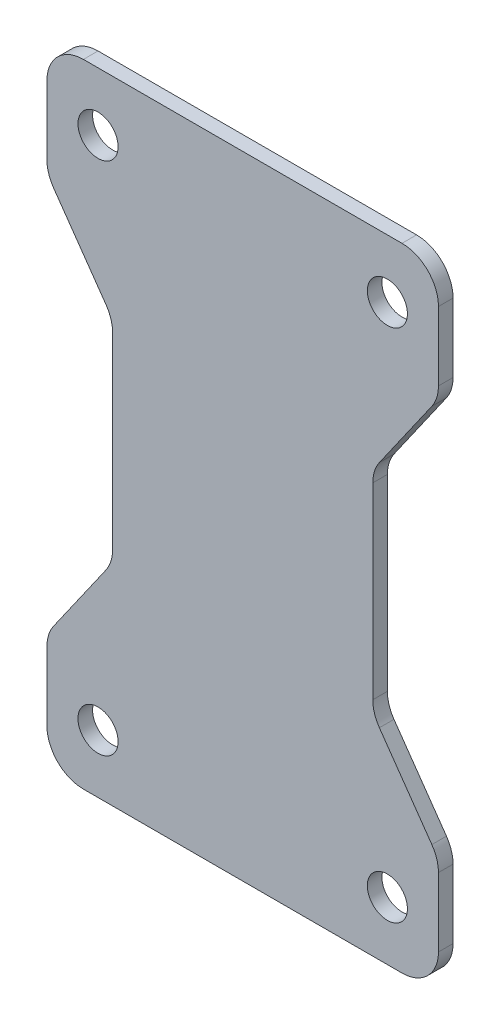
ISO-10303-21;
HEADER;
FILE_DESCRIPTION(('STEP AP214'),'2;1');
FILE_NAME('part.step','',(''),(''),'','','');
FILE_SCHEMA(('AUTOMOTIVE_DESIGN { 1 0 10303 214 1 1 1 1 }'));
ENDSEC;
DATA;
#1=APPLICATION_CONTEXT('core data for automotive mechanical design processes');
#2=APPLICATION_PROTOCOL_DEFINITION('international standard','automotive_design',2000,#1);
#3=PRODUCT_CONTEXT('',#1,'mechanical');
#4=PRODUCT('Part','Part','',(#3));
#5=PRODUCT_RELATED_PRODUCT_CATEGORY('part','',(#4));
#6=PRODUCT_DEFINITION_FORMATION('','',#4);
#7=PRODUCT_DEFINITION_CONTEXT('part definition',#1,'design');
#8=PRODUCT_DEFINITION('design','',#6,#7);
#9=PRODUCT_DEFINITION_SHAPE('','',#8);
#10=(LENGTH_UNIT() NAMED_UNIT(*) SI_UNIT(.MILLI.,.METRE.));
#11=(NAMED_UNIT(*) PLANE_ANGLE_UNIT() SI_UNIT($,.RADIAN.));
#12=(NAMED_UNIT(*) SI_UNIT($,.STERADIAN.) SOLID_ANGLE_UNIT());
#13=UNCERTAINTY_MEASURE_WITH_UNIT(LENGTH_MEASURE(1.E-05),#10,'distance_accuracy_value','');
#14=(GEOMETRIC_REPRESENTATION_CONTEXT(3) GLOBAL_UNCERTAINTY_ASSIGNED_CONTEXT((#13)) GLOBAL_UNIT_ASSIGNED_CONTEXT((#10,
#11,#12)) REPRESENTATION_CONTEXT('',''));
#15=CARTESIAN_POINT('',(0.,0.,0.));
#16=DIRECTION('',(0.,0.,1.));
#17=DIRECTION('',(1.,0.,0.));
#18=AXIS2_PLACEMENT_3D('',#15,#16,#17);
#19=CARTESIAN_POINT('',(0.,203.199999999963,29.6500000000131));
#20=DIRECTION('',(0.,1.,0.));
#21=DIRECTION('',(0.,0.,1.));
#22=AXIS2_PLACEMENT_3D('',#19,#20,#21);
#23=PLANE('',#22);
#24=DIRECTION('',(1.,0.,0.));
#25=VECTOR('',#24,1.);
#26=CARTESIAN_POINT('',(0.,203.199999999963,29.6500000000131));
#27=LINE('',#26,#25);
#28=CARTESIAN_POINT('',(-43.6500000000131,203.199999999963,29.6500000000131));
#29=VERTEX_POINT('',#28);
#30=CARTESIAN_POINT('',(43.6500000000131,203.199999999963,29.6500000000131));
#31=VERTEX_POINT('',#30);
#32=EDGE_CURVE('E219',#29,#31,#27,.T.);
#33=ORIENTED_EDGE('',*,*,#32,.T.);
#34=DIRECTION('',(0.,0.,-1.));
#35=VECTOR('',#34,1.);
#36=CARTESIAN_POINT('',(43.6500000000131,203.199999999963,25.6500000000131));
#37=LINE('',#36,#35);
#38=CARTESIAN_POINT('',(43.6500000000131,203.199999999963,25.6500000000131));
#39=VERTEX_POINT('',#38);
#40=EDGE_CURVE('E368',#31,#39,#37,.T.);
#41=ORIENTED_EDGE('',*,*,#40,.T.);
#42=DIRECTION('',(1.,0.,0.));
#43=VECTOR('',#42,1.);
#44=CARTESIAN_POINT('',(0.,203.199999999963,25.6500000000131));
#45=LINE('',#44,#43);
#46=CARTESIAN_POINT('',(-43.6500000000131,203.199999999963,25.6500000000131));
#47=VERTEX_POINT('',#46);
#48=EDGE_CURVE('E246',#47,#39,#45,.T.);
#49=ORIENTED_EDGE('',*,*,#48,.F.);
#50=DIRECTION('',(0.,0.,-1.));
#51=VECTOR('',#50,1.);
#52=CARTESIAN_POINT('',(-43.6500000000131,203.199999999963,25.6500000000131));
#53=LINE('',#52,#51);
#54=EDGE_CURVE('E239',#29,#47,#53,.T.);
#55=ORIENTED_EDGE('',*,*,#54,.F.);
#56=EDGE_LOOP('',(#33,#41,#49,#55));
#57=FACE_BOUND('',#56,.T.);
#58=ADVANCED_FACE('F59',(#57),#23,.T.);
#59=CARTESIAN_POINT('',(0.,29.9999999999816,29.6500000000131));
#60=DIRECTION('',(0.,1.,0.));
#61=DIRECTION('',(0.,0.,1.));
#62=AXIS2_PLACEMENT_3D('',#59,#60,#61);
#63=PLANE('',#62);
#64=DIRECTION('',(1.,0.,0.));
#65=VECTOR('',#64,1.);
#66=CARTESIAN_POINT('',(0.,29.9999999999816,25.6500000000131));
#67=LINE('',#66,#65);
#68=CARTESIAN_POINT('',(-43.6500000000131,29.9999999999816,25.6500000000131));
#69=VERTEX_POINT('',#68);
#70=CARTESIAN_POINT('',(43.6500000000131,29.9999999999816,25.6500000000131));
#71=VERTEX_POINT('',#70);
#72=EDGE_CURVE('E370',#69,#71,#67,.T.);
#73=ORIENTED_EDGE('',*,*,#72,.T.);
#74=DIRECTION('',(0.,0.,-1.));
#75=VECTOR('',#74,1.);
#76=CARTESIAN_POINT('',(43.6500000000131,29.9999999999816,29.6500000000131));
#77=LINE('',#76,#75);
#78=CARTESIAN_POINT('',(43.6500000000131,29.9999999999816,29.6500000000131));
#79=VERTEX_POINT('',#78);
#80=EDGE_CURVE('E412',#71,#79,#77,.F.);
#81=ORIENTED_EDGE('',*,*,#80,.T.);
#82=DIRECTION('',(1.,0.,0.));
#83=VECTOR('',#82,1.);
#84=CARTESIAN_POINT('',(0.,29.9999999999816,29.6500000000131));
#85=LINE('',#84,#83);
#86=CARTESIAN_POINT('',(-43.6500000000131,29.9999999999816,29.6500000000131));
#87=VERTEX_POINT('',#86);
#88=EDGE_CURVE('E233',#87,#79,#85,.T.);
#89=ORIENTED_EDGE('',*,*,#88,.F.);
#90=DIRECTION('',(0.,0.,-1.));
#91=VECTOR('',#90,1.);
#92=CARTESIAN_POINT('',(-43.6500000000131,29.9999999999816,29.6500000000131));
#93=LINE('',#92,#91);
#94=EDGE_CURVE('E248',#69,#87,#93,.F.);
#95=ORIENTED_EDGE('',*,*,#94,.F.);
#96=EDGE_LOOP('',(#73,#81,#89,#95));
#97=FACE_BOUND('',#96,.T.);
#98=ADVANCED_FACE('F510',(#97),#63,.F.);
#99=CARTESIAN_POINT('',(53.6500000000131,0.,29.6500000000131));
#100=DIRECTION('',(-1.,0.,0.));
#101=DIRECTION('',(0.,-1.,0.));
#102=AXIS2_PLACEMENT_3D('',#99,#100,#101);
#103=PLANE('',#102);
#104=DIRECTION('',(0.,1.,0.));
#105=VECTOR('',#104,1.);
#106=CARTESIAN_POINT('',(53.6500000000131,0.,29.6500000000131));
#107=LINE('',#106,#105);
#108=CARTESIAN_POINT('',(53.6500000000131,39.9999999999816,29.6500000000131));
#109=VERTEX_POINT('',#108);
#110=CARTESIAN_POINT('',(53.6500000000131,58.8470121111919,29.6500000000131));
#111=VERTEX_POINT('',#110);
#112=EDGE_CURVE('E356',#109,#111,#107,.T.);
#113=ORIENTED_EDGE('',*,*,#112,.F.);
#114=DIRECTION('',(0.,0.,-1.));
#115=VECTOR('',#114,1.);
#116=CARTESIAN_POINT('',(53.6500000000131,39.9999999999816,29.6500000000131));
#117=LINE('',#116,#115);
#118=CARTESIAN_POINT('',(53.6500000000131,39.9999999999816,25.6500000000131));
#119=VERTEX_POINT('',#118);
#120=EDGE_CURVE('E409',#109,#119,#117,.T.);
#121=ORIENTED_EDGE('',*,*,#120,.T.);
#122=DIRECTION('',(0.,1.,0.));
#123=VECTOR('',#122,1.);
#124=CARTESIAN_POINT('',(53.6500000000131,0.,25.6500000000131));
#125=LINE('',#124,#123);
#126=CARTESIAN_POINT('',(53.6500000000131,58.8470121111919,25.6500000000131));
#127=VERTEX_POINT('',#126);
#128=EDGE_CURVE('E372',#119,#127,#125,.T.);
#129=ORIENTED_EDGE('',*,*,#128,.T.);
#130=DIRECTION('',(0.,0.,-1.));
#131=VECTOR('',#130,1.);
#132=CARTESIAN_POINT('',(53.6500000000131,58.8470121111919,29.6500000000131));
#133=LINE('',#132,#131);
#134=EDGE_CURVE('E407',#127,#111,#133,.F.);
#135=ORIENTED_EDGE('',*,*,#134,.T.);
#136=EDGE_LOOP('',(#113,#121,#129,#135));
#137=FACE_BOUND('',#136,.T.);
#138=ADVANCED_FACE('F516',(#137),#103,.F.);
#139=CARTESIAN_POINT('',(65.1301615890744,45.6046301094862,29.6500000000131));
#140=DIRECTION('',(-0.819152044288993,-0.573576436351045,0.));
#141=DIRECTION('',(0.573576436351045,-0.819152044288993,0.));
#142=AXIS2_PLACEMENT_3D('',#139,#140,#141);
#143=PLANE('',#142);
#144=DIRECTION('',(-0.573576436351045,0.819152044288993,0.));
#145=VECTOR('',#144,1.);
#146=CARTESIAN_POINT('',(65.1301615890744,45.6046301094862,25.6500000000131));
#147=LINE('',#146,#145);
#148=CARTESIAN_POINT('',(51.841520442903,64.5827764747023,25.6500000000131));
#149=VERTEX_POINT('',#148);
#150=CARTESIAN_POINT('',(37.4584795571231,85.1238876466192,25.6500000000131));
#151=VERTEX_POINT('',#150);
#152=EDGE_CURVE('E375',#149,#151,#147,.T.);
#153=ORIENTED_EDGE('',*,*,#152,.T.);
#154=DIRECTION('',(0.,0.,-1.));
#155=VECTOR('',#154,1.);
#156=CARTESIAN_POINT('',(37.4584795571231,85.1238876466192,29.6500000000131));
#157=LINE('',#156,#155);
#158=CARTESIAN_POINT('',(37.4584795571231,85.1238876466192,29.6500000000131));
#159=VERTEX_POINT('',#158);
#160=EDGE_CURVE('E427',#151,#159,#157,.F.);
#161=ORIENTED_EDGE('',*,*,#160,.T.);
#162=DIRECTION('',(-0.573576436351045,0.819152044288993,0.));
#163=VECTOR('',#162,1.);
#164=CARTESIAN_POINT('',(65.1301615890744,45.6046301094862,29.6500000000131));
#165=LINE('',#164,#163);
#166=CARTESIAN_POINT('',(51.841520442903,64.5827764747023,29.6500000000131));
#167=VERTEX_POINT('',#166);
#168=EDGE_CURVE('E359',#167,#159,#165,.T.);
#169=ORIENTED_EDGE('',*,*,#168,.F.);
#170=DIRECTION('',(0.,0.,-1.));
#171=VECTOR('',#170,1.);
#172=CARTESIAN_POINT('',(51.841520442903,64.5827764747023,29.6500000000131));
#173=LINE('',#172,#171);
#174=EDGE_CURVE('E424',#167,#149,#173,.T.);
#175=ORIENTED_EDGE('',*,*,#174,.T.);
#176=EDGE_LOOP('',(#153,#161,#169,#175));
#177=FACE_BOUND('',#176,.T.);
#178=ADVANCED_FACE('F440',(#177),#143,.F.);
#179=CARTESIAN_POINT('',(35.6500000000131,0.,29.6500000000131));
#180=DIRECTION('',(-1.,0.,0.));
#181=DIRECTION('',(0.,0.,1.));
#182=AXIS2_PLACEMENT_3D('',#179,#180,#181);
#183=PLANE('',#182);
#184=DIRECTION('',(0.,1.,0.));
#185=VECTOR('',#184,1.);
#186=CARTESIAN_POINT('',(35.6500000000131,0.,25.6500000000131));
#187=LINE('',#186,#185);
#188=CARTESIAN_POINT('',(35.6500000000131,90.8596520101297,25.6500000000131));
#189=VERTEX_POINT('',#188);
#190=CARTESIAN_POINT('',(35.6500000000131,142.340347989815,25.6500000000131));
#191=VERTEX_POINT('',#190);
#192=EDGE_CURVE('E378',#189,#191,#187,.T.);
#193=ORIENTED_EDGE('',*,*,#192,.T.);
#194=DIRECTION('',(0.,0.,-1.));
#195=VECTOR('',#194,1.);
#196=CARTESIAN_POINT('',(35.6500000000131,142.340347989815,29.6500000000131));
#197=LINE('',#196,#195);
#198=CARTESIAN_POINT('',(35.6500000000131,142.340347989815,29.6500000000131));
#199=VERTEX_POINT('',#198);
#200=EDGE_CURVE('E422',#191,#199,#197,.F.);
#201=ORIENTED_EDGE('',*,*,#200,.T.);
#202=DIRECTION('',(0.,1.,0.));
#203=VECTOR('',#202,1.);
#204=CARTESIAN_POINT('',(35.6500000000131,0.,29.6500000000131));
#205=LINE('',#204,#203);
#206=CARTESIAN_POINT('',(35.6500000000131,90.8596520101297,29.6500000000131));
#207=VERTEX_POINT('',#206);
#208=EDGE_CURVE('E362',#207,#199,#205,.T.);
#209=ORIENTED_EDGE('',*,*,#208,.F.);
#210=DIRECTION('',(0.,0.,-1.));
#211=VECTOR('',#210,1.);
#212=CARTESIAN_POINT('',(35.6500000000131,90.8596520101297,25.6500000000131));
#213=LINE('',#212,#211);
#214=EDGE_CURVE('E419',#207,#189,#213,.T.);
#215=ORIENTED_EDGE('',*,*,#214,.T.);
#216=EDGE_LOOP('',(#193,#201,#209,#215));
#217=FACE_BOUND('',#216,.T.);
#218=ADVANCED_FACE('F447',(#217),#183,.F.);
#219=CARTESIAN_POINT('',(-44.4379979945365,31.1158211787224,29.6500000000131));
#220=DIRECTION('',(-0.819152044288992,0.573576436351045,0.));
#221=DIRECTION('',(-0.573576436351045,-0.819152044288992,0.));
#222=AXIS2_PLACEMENT_3D('',#219,#220,#221);
#223=PLANE('',#222);
#224=DIRECTION('',(0.573576436351045,0.819152044288992,0.));
#225=VECTOR('',#224,1.);
#226=CARTESIAN_POINT('',(-44.4379979945365,31.1158211787224,25.6500000000131));
#227=LINE('',#226,#225);
#228=CARTESIAN_POINT('',(37.4584795571231,148.076112353326,25.6500000000131));
#229=VERTEX_POINT('',#228);
#230=CARTESIAN_POINT('',(51.841520442903,168.617223525243,25.6500000000131));
#231=VERTEX_POINT('',#230);
#232=EDGE_CURVE('E381',#229,#231,#227,.T.);
#233=ORIENTED_EDGE('',*,*,#232,.T.);
#234=DIRECTION('',(0.,0.,-1.));
#235=VECTOR('',#234,1.);
#236=CARTESIAN_POINT('',(51.841520442903,168.617223525243,29.6500000000131));
#237=LINE('',#236,#235);
#238=CARTESIAN_POINT('',(51.841520442903,168.617223525243,29.6500000000131));
#239=VERTEX_POINT('',#238);
#240=EDGE_CURVE('E74',#231,#239,#237,.F.);
#241=ORIENTED_EDGE('',*,*,#240,.T.);
#242=DIRECTION('',(0.573576436351045,0.819152044288992,0.));
#243=VECTOR('',#242,1.);
#244=CARTESIAN_POINT('',(-44.4379979945365,31.1158211787224,29.6500000000131));
#245=LINE('',#244,#243);
#246=CARTESIAN_POINT('',(37.4584795571231,148.076112353326,29.6500000000131));
#247=VERTEX_POINT('',#246);
#248=EDGE_CURVE('E364',#247,#239,#245,.T.);
#249=ORIENTED_EDGE('',*,*,#248,.F.);
#250=DIRECTION('',(0.,0.,-1.));
#251=VECTOR('',#250,1.);
#252=CARTESIAN_POINT('',(37.4584795571231,148.076112353326,25.6500000000131));
#253=LINE('',#252,#251);
#254=EDGE_CURVE('E415',#247,#229,#253,.T.);
#255=ORIENTED_EDGE('',*,*,#254,.T.);
#256=EDGE_LOOP('',(#233,#241,#249,#255));
#257=FACE_BOUND('',#256,.T.);
#258=ADVANCED_FACE('F453',(#257),#223,.F.);
#259=CARTESIAN_POINT('',(53.6500000000131,0.,29.6500000000131));
#260=DIRECTION('',(-1.,0.,0.));
#261=DIRECTION('',(0.,0.,1.));
#262=AXIS2_PLACEMENT_3D('',#259,#260,#261);
#263=PLANE('',#262);
#264=DIRECTION('',(0.,1.,0.));
#265=VECTOR('',#264,1.);
#266=CARTESIAN_POINT('',(53.6500000000131,0.,25.6500000000131));
#267=LINE('',#266,#265);
#268=CARTESIAN_POINT('',(53.6500000000131,174.352987888753,25.6500000000131));
#269=VERTEX_POINT('',#268);
#270=CARTESIAN_POINT('',(53.6500000000131,193.199999999963,25.6500000000131));
#271=VERTEX_POINT('',#270);
#272=EDGE_CURVE('E234',#269,#271,#267,.T.);
#273=ORIENTED_EDGE('',*,*,#272,.T.);
#274=DIRECTION('',(0.,0.,-1.));
#275=VECTOR('',#274,1.);
#276=CARTESIAN_POINT('',(53.6500000000131,193.199999999963,29.6500000000131));
#277=LINE('',#276,#275);
#278=CARTESIAN_POINT('',(53.6500000000131,193.199999999963,29.6500000000131));
#279=VERTEX_POINT('',#278);
#280=EDGE_CURVE('E398',#271,#279,#277,.F.);
#281=ORIENTED_EDGE('',*,*,#280,.T.);
#282=DIRECTION('',(0.,1.,0.));
#283=VECTOR('',#282,1.);
#284=CARTESIAN_POINT('',(53.6500000000131,0.,29.6500000000131));
#285=LINE('',#284,#283);
#286=CARTESIAN_POINT('',(53.6500000000131,174.352987888753,29.6500000000131));
#287=VERTEX_POINT('',#286);
#288=EDGE_CURVE('E366',#287,#279,#285,.T.);
#289=ORIENTED_EDGE('',*,*,#288,.F.);
#290=DIRECTION('',(0.,0.,-1.));
#291=VECTOR('',#290,1.);
#292=CARTESIAN_POINT('',(53.6500000000131,174.352987888753,29.6500000000131));
#293=LINE('',#292,#291);
#294=EDGE_CURVE('E395',#287,#269,#293,.T.);
#295=ORIENTED_EDGE('',*,*,#294,.T.);
#296=EDGE_LOOP('',(#273,#281,#289,#295));
#297=FACE_BOUND('',#296,.T.);
#298=ADVANCED_FACE('F461',(#297),#263,.F.);
#299=CARTESIAN_POINT('',(0.,0.,29.6500000000131));
#300=DIRECTION('',(0.,0.,1.));
#301=DIRECTION('',(1.,0.,0.));
#302=AXIS2_PLACEMENT_3D('',#299,#300,#301);
#303=PLANE('',#302);
#304=ORIENTED_EDGE('',*,*,#88,.T.);
#305=CARTESIAN_POINT('',(43.6500000000131,39.9999999999816,29.6500000000131));
#306=DIRECTION('',(0.,0.,1.));
#307=DIRECTION('',(1.,0.,0.));
#308=AXIS2_PLACEMENT_3D('',#305,#306,#307);
#309=CIRCLE('',#308,10.);
#310=EDGE_CURVE('E404',#79,#109,#309,.T.);
#311=ORIENTED_EDGE('',*,*,#310,.T.);
#312=ORIENTED_EDGE('',*,*,#112,.T.);
#313=CARTESIAN_POINT('',(43.650000000013,58.8470121111918,29.6500000000131));
#314=DIRECTION('',(0.,0.,1.));
#315=DIRECTION('',(1.,0.,0.));
#316=AXIS2_PLACEMENT_3D('',#313,#314,#315);
#317=CIRCLE('',#316,10.);
#318=EDGE_CURVE('E400',#111,#167,#317,.T.);
#319=ORIENTED_EDGE('',*,*,#318,.T.);
#320=ORIENTED_EDGE('',*,*,#168,.T.);
#321=CARTESIAN_POINT('',(45.6500000000131,90.8596520101297,29.6500000000131));
#322=DIRECTION('',(0.,0.,1.));
#323=DIRECTION('',(1.,0.,0.));
#324=AXIS2_PLACEMENT_3D('',#321,#322,#323);
#325=CIRCLE('',#324,10.);
#326=EDGE_CURVE('E12',#159,#207,#325,.F.);
#327=ORIENTED_EDGE('',*,*,#326,.T.);
#328=ORIENTED_EDGE('',*,*,#208,.T.);
#329=CARTESIAN_POINT('',(45.6500000000131,142.340347989815,29.6500000000131));
#330=DIRECTION('',(0.,0.,1.));
#331=DIRECTION('',(1.,0.,0.));
#332=AXIS2_PLACEMENT_3D('',#329,#330,#331);
#333=CIRCLE('',#332,10.);
#334=EDGE_CURVE('E81',#199,#247,#333,.F.);
#335=ORIENTED_EDGE('',*,*,#334,.T.);
#336=ORIENTED_EDGE('',*,*,#248,.T.);
#337=CARTESIAN_POINT('',(43.6500000000131,174.352987888753,29.6500000000131));
#338=DIRECTION('',(0.,0.,1.));
#339=DIRECTION('',(1.,0.,0.));
#340=AXIS2_PLACEMENT_3D('',#337,#338,#339);
#341=CIRCLE('',#340,10.);
#342=EDGE_CURVE('E402',#239,#287,#341,.T.);
#343=ORIENTED_EDGE('',*,*,#342,.T.);
#344=ORIENTED_EDGE('',*,*,#288,.T.);
#345=CARTESIAN_POINT('',(43.6500000000131,193.199999999963,29.6500000000131));
#346=DIRECTION('',(0.,0.,1.));
#347=DIRECTION('',(1.,0.,0.));
#348=AXIS2_PLACEMENT_3D('',#345,#346,#347);
#349=CIRCLE('',#348,10.);
#350=EDGE_CURVE('E228',#279,#31,#349,.T.);
#351=ORIENTED_EDGE('',*,*,#350,.T.);
#352=ORIENTED_EDGE('',*,*,#32,.F.);
#353=CARTESIAN_POINT('',(-43.6500000000131,193.199999999963,29.6500000000131));
#354=DIRECTION('',(0.,0.,-1.));
#355=DIRECTION('',(-1.,0.,0.));
#356=AXIS2_PLACEMENT_3D('',#353,#354,#355);
#357=CIRCLE('',#356,10.);
#358=CARTESIAN_POINT('',(-53.6500000000131,193.199999999963,29.6500000000131));
#359=VERTEX_POINT('',#358);
#360=EDGE_CURVE('E224',#359,#29,#357,.T.);
#361=ORIENTED_EDGE('',*,*,#360,.F.);
#362=DIRECTION('',(0.,1.,0.));
#363=VECTOR('',#362,1.);
#364=CARTESIAN_POINT('',(-53.6500000000131,0.,29.6500000000131));
#365=LINE('',#364,#363);
#366=CARTESIAN_POINT('',(-53.6500000000131,174.352987888753,29.6500000000131));
#367=VERTEX_POINT('',#366);
#368=EDGE_CURVE('E305',#367,#359,#365,.T.);
#369=ORIENTED_EDGE('',*,*,#368,.F.);
#370=CARTESIAN_POINT('',(-43.6500000000131,174.352987888753,29.6500000000131));
#371=DIRECTION('',(0.,0.,-1.));
#372=DIRECTION('',(-1.,0.,0.));
#373=AXIS2_PLACEMENT_3D('',#370,#371,#372);
#374=CIRCLE('',#373,10.);
#375=CARTESIAN_POINT('',(-51.841520442903,168.617223525243,29.6500000000131));
#376=VERTEX_POINT('',#375);
#377=EDGE_CURVE('E322',#376,#367,#374,.T.);
#378=ORIENTED_EDGE('',*,*,#377,.F.);
#379=DIRECTION('',(-0.573576436351045,0.819152044288992,0.));
#380=VECTOR('',#379,1.);
#381=CARTESIAN_POINT('',(44.4379979945365,31.1158211787224,29.6500000000131));
#382=LINE('',#381,#380);
#383=CARTESIAN_POINT('',(-37.4584795571231,148.076112353326,29.6500000000131));
#384=VERTEX_POINT('',#383);
#385=EDGE_CURVE('E295',#384,#376,#382,.T.);
#386=ORIENTED_EDGE('',*,*,#385,.F.);
#387=CARTESIAN_POINT('',(-45.6500000000131,142.340347989815,29.6500000000131));
#388=DIRECTION('',(0.,0.,-1.));
#389=DIRECTION('',(-1.,0.,0.));
#390=AXIS2_PLACEMENT_3D('',#387,#388,#389);
#391=CIRCLE('',#390,10.);
#392=CARTESIAN_POINT('',(-35.6500000000131,142.340347989815,29.6500000000131));
#393=VERTEX_POINT('',#392);
#394=EDGE_CURVE('E320',#393,#384,#391,.F.);
#395=ORIENTED_EDGE('',*,*,#394,.F.);
#396=DIRECTION('',(0.,1.,0.));
#397=VECTOR('',#396,1.);
#398=CARTESIAN_POINT('',(-35.6500000000131,0.,29.6500000000131));
#399=LINE('',#398,#397);
#400=CARTESIAN_POINT('',(-35.6500000000131,90.8596520101297,29.6500000000131));
#401=VERTEX_POINT('',#400);
#402=EDGE_CURVE('E283',#401,#393,#399,.T.);
#403=ORIENTED_EDGE('',*,*,#402,.F.);
#404=CARTESIAN_POINT('',(-45.6500000000131,90.8596520101297,29.6500000000131));
#405=DIRECTION('',(0.,0.,-1.));
#406=DIRECTION('',(-1.,0.,0.));
#407=AXIS2_PLACEMENT_3D('',#404,#405,#406);
#408=CIRCLE('',#407,10.);
#409=CARTESIAN_POINT('',(-37.4584795571231,85.1238876466192,29.6500000000131));
#410=VERTEX_POINT('',#409);
#411=EDGE_CURVE('E318',#410,#401,#408,.F.);
#412=ORIENTED_EDGE('',*,*,#411,.F.);
#413=DIRECTION('',(0.573576436351045,0.819152044288993,0.));
#414=VECTOR('',#413,1.);
#415=CARTESIAN_POINT('',(-65.1301615890744,45.6046301094862,29.6500000000131));
#416=LINE('',#415,#414);
#417=CARTESIAN_POINT('',(-51.841520442903,64.5827764747023,29.6500000000131));
#418=VERTEX_POINT('',#417);
#419=EDGE_CURVE('E271',#418,#410,#416,.T.);
#420=ORIENTED_EDGE('',*,*,#419,.F.);
#421=CARTESIAN_POINT('',(-43.650000000013,58.8470121111918,29.6500000000131));
#422=DIRECTION('',(0.,0.,-1.));
#423=DIRECTION('',(-1.,0.,0.));
#424=AXIS2_PLACEMENT_3D('',#421,#422,#423);
#425=CIRCLE('',#424,10.);
#426=CARTESIAN_POINT('',(-53.6500000000131,58.8470121111919,29.6500000000131));
#427=VERTEX_POINT('',#426);
#428=EDGE_CURVE('E316',#427,#418,#425,.T.);
#429=ORIENTED_EDGE('',*,*,#428,.F.);
#430=DIRECTION('',(0.,1.,0.));
#431=VECTOR('',#430,1.);
#432=CARTESIAN_POINT('',(-53.6500000000131,0.,29.6500000000131));
#433=LINE('',#432,#431);
#434=CARTESIAN_POINT('',(-53.6500000000131,39.9999999999816,29.6500000000131));
#435=VERTEX_POINT('',#434);
#436=EDGE_CURVE('E251',#435,#427,#433,.T.);
#437=ORIENTED_EDGE('',*,*,#436,.F.);
#438=CARTESIAN_POINT('',(-43.6500000000131,39.9999999999816,29.6500000000131));
#439=DIRECTION('',(0.,0.,-1.));
#440=DIRECTION('',(-1.,0.,0.));
#441=AXIS2_PLACEMENT_3D('',#438,#439,#440);
#442=CIRCLE('',#441,10.);
#443=EDGE_CURVE('E243',#87,#435,#442,.T.);
#444=ORIENTED_EDGE('',*,*,#443,.F.);
#445=EDGE_LOOP('',(#304,#311,#312,#319,#320,#327,#328,#335,#336,#343,#344,#351,#352,#361,#369,
#378,#386,#395,#403,#412,#420,#429,#437,#444));
#446=FACE_BOUND('',#445,.T.);
#447=CARTESIAN_POINT('',(39.6500000000131,45.9999999999816,29.6500000000131));
#448=DIRECTION('',(0.,0.,-1.));
#449=DIRECTION('',(-1.,0.,0.));
#450=AXIS2_PLACEMENT_3D('',#447,#448,#449);
#451=CIRCLE('',#450,5.5);
#452=CARTESIAN_POINT('',(34.1500000000131,45.9999999999816,29.6500000000131));
#453=VERTEX_POINT('',#452);
#454=EDGE_CURVE('E346',#453,#453,#451,.T.);
#455=ORIENTED_EDGE('',*,*,#454,.T.);
#456=EDGE_LOOP('',(#455));
#457=FACE_BOUND('',#456,.T.);
#458=CARTESIAN_POINT('',(39.6500000000131,187.199999999963,29.6500000000131));
#459=DIRECTION('',(0.,0.,-1.));
#460=DIRECTION('',(-1.,0.,0.));
#461=AXIS2_PLACEMENT_3D('',#458,#459,#460);
#462=CIRCLE('',#461,5.5);
#463=CARTESIAN_POINT('',(34.1500000000131,187.199999999963,29.6500000000131));
#464=VERTEX_POINT('',#463);
#465=EDGE_CURVE('E352',#464,#464,#462,.T.);
#466=ORIENTED_EDGE('',*,*,#465,.T.);
#467=EDGE_LOOP('',(#466));
#468=FACE_BOUND('',#467,.T.);
#469=CARTESIAN_POINT('',(-39.6500000000131,187.199999999963,29.6500000000131));
#470=DIRECTION('',(0.,0.,1.));
#471=DIRECTION('',(1.,0.,0.));
#472=AXIS2_PLACEMENT_3D('',#469,#470,#471);
#473=CIRCLE('',#472,5.5);
#474=CARTESIAN_POINT('',(-34.1500000000131,187.199999999963,29.6500000000131));
#475=VERTEX_POINT('',#474);
#476=EDGE_CURVE('E244',#475,#475,#473,.T.);
#477=ORIENTED_EDGE('',*,*,#476,.F.);
#478=EDGE_LOOP('',(#477));
#479=FACE_BOUND('',#478,.T.);
#480=CARTESIAN_POINT('',(-39.6500000000131,45.9999999999816,29.6500000000131));
#481=DIRECTION('',(0.,0.,1.));
#482=DIRECTION('',(1.,0.,0.));
#483=AXIS2_PLACEMENT_3D('',#480,#481,#482);
#484=CIRCLE('',#483,5.5);
#485=CARTESIAN_POINT('',(-34.1500000000131,45.9999999999816,29.6500000000131));
#486=VERTEX_POINT('',#485);
#487=EDGE_CURVE('E310',#486,#486,#484,.T.);
#488=ORIENTED_EDGE('',*,*,#487,.F.);
#489=EDGE_LOOP('',(#488));
#490=FACE_BOUND('',#489,.T.);
#491=ADVANCED_FACE('F221',(#446,#457,#468,#479,#490),#303,.T.);
#492=CARTESIAN_POINT('',(0.,0.,25.6500000000131));
#493=DIRECTION('',(0.,0.,1.));
#494=DIRECTION('',(1.,0.,0.));
#495=AXIS2_PLACEMENT_3D('',#492,#493,#494);
#496=PLANE('',#495);
#497=ORIENTED_EDGE('',*,*,#48,.T.);
#498=CARTESIAN_POINT('',(43.6500000000131,193.199999999963,25.6500000000131));
#499=DIRECTION('',(0.,0.,1.));
#500=DIRECTION('',(1.,0.,0.));
#501=AXIS2_PLACEMENT_3D('',#498,#499,#500);
#502=CIRCLE('',#501,10.);
#503=EDGE_CURVE('E393',#39,#271,#502,.F.);
#504=ORIENTED_EDGE('',*,*,#503,.T.);
#505=ORIENTED_EDGE('',*,*,#272,.F.);
#506=CARTESIAN_POINT('',(43.6500000000131,174.352987888753,25.6500000000131));
#507=DIRECTION('',(0.,0.,1.));
#508=DIRECTION('',(1.,0.,0.));
#509=AXIS2_PLACEMENT_3D('',#506,#507,#508);
#510=CIRCLE('',#509,10.);
#511=EDGE_CURVE('E388',#269,#231,#510,.F.);
#512=ORIENTED_EDGE('',*,*,#511,.T.);
#513=ORIENTED_EDGE('',*,*,#232,.F.);
#514=CARTESIAN_POINT('',(45.6500000000131,142.340347989815,25.6500000000131));
#515=DIRECTION('',(0.,0.,1.));
#516=DIRECTION('',(1.,0.,0.));
#517=AXIS2_PLACEMENT_3D('',#514,#515,#516);
#518=CIRCLE('',#517,10.);
#519=EDGE_CURVE('E429',#229,#191,#518,.T.);
#520=ORIENTED_EDGE('',*,*,#519,.T.);
#521=ORIENTED_EDGE('',*,*,#192,.F.);
#522=CARTESIAN_POINT('',(45.6500000000131,90.8596520101297,25.6500000000131));
#523=DIRECTION('',(0.,0.,1.));
#524=DIRECTION('',(1.,0.,0.));
#525=AXIS2_PLACEMENT_3D('',#522,#523,#524);
#526=CIRCLE('',#525,10.);
#527=EDGE_CURVE('E67',#189,#151,#526,.T.);
#528=ORIENTED_EDGE('',*,*,#527,.T.);
#529=ORIENTED_EDGE('',*,*,#152,.F.);
#530=CARTESIAN_POINT('',(43.650000000013,58.8470121111918,25.6500000000131));
#531=DIRECTION('',(0.,0.,1.));
#532=DIRECTION('',(1.,0.,0.));
#533=AXIS2_PLACEMENT_3D('',#530,#531,#532);
#534=CIRCLE('',#533,10.);
#535=EDGE_CURVE('E386',#149,#127,#534,.F.);
#536=ORIENTED_EDGE('',*,*,#535,.T.);
#537=ORIENTED_EDGE('',*,*,#128,.F.);
#538=CARTESIAN_POINT('',(43.6500000000131,39.9999999999816,25.6500000000131));
#539=DIRECTION('',(0.,0.,1.));
#540=DIRECTION('',(1.,0.,0.));
#541=AXIS2_PLACEMENT_3D('',#538,#539,#540);
#542=CIRCLE('',#541,10.);
#543=EDGE_CURVE('E390',#119,#71,#542,.F.);
#544=ORIENTED_EDGE('',*,*,#543,.T.);
#545=ORIENTED_EDGE('',*,*,#72,.F.);
#546=CARTESIAN_POINT('',(-43.6500000000131,39.9999999999816,25.6500000000131));
#547=DIRECTION('',(0.,0.,-1.));
#548=DIRECTION('',(-1.,0.,0.));
#549=AXIS2_PLACEMENT_3D('',#546,#547,#548);
#550=CIRCLE('',#549,10.);
#551=CARTESIAN_POINT('',(-53.6500000000131,39.9999999999816,25.6500000000131));
#552=VERTEX_POINT('',#551);
#553=EDGE_CURVE('E340',#552,#69,#550,.F.);
#554=ORIENTED_EDGE('',*,*,#553,.F.);
#555=DIRECTION('',(0.,1.,0.));
#556=VECTOR('',#555,1.);
#557=CARTESIAN_POINT('',(-53.6500000000131,0.,25.6500000000131));
#558=LINE('',#557,#556);
#559=CARTESIAN_POINT('',(-53.6500000000131,58.8470121111919,25.6500000000131));
#560=VERTEX_POINT('',#559);
#561=EDGE_CURVE('E259',#552,#560,#558,.T.);
#562=ORIENTED_EDGE('',*,*,#561,.T.);
#563=CARTESIAN_POINT('',(-43.650000000013,58.8470121111918,25.6500000000131));
#564=DIRECTION('',(0.,0.,-1.));
#565=DIRECTION('',(-1.,0.,0.));
#566=AXIS2_PLACEMENT_3D('',#563,#564,#565);
#567=CIRCLE('',#566,10.);
#568=CARTESIAN_POINT('',(-51.841520442903,64.5827764747023,25.6500000000131));
#569=VERTEX_POINT('',#568);
#570=EDGE_CURVE('E338',#569,#560,#567,.F.);
#571=ORIENTED_EDGE('',*,*,#570,.F.);
#572=DIRECTION('',(0.573576436351045,0.819152044288993,0.));
#573=VECTOR('',#572,1.);
#574=CARTESIAN_POINT('',(-65.1301615890744,45.6046301094862,25.6500000000131));
#575=LINE('',#574,#573);
#576=CARTESIAN_POINT('',(-37.4584795571231,85.1238876466192,25.6500000000131));
#577=VERTEX_POINT('',#576);
#578=EDGE_CURVE('E265',#569,#577,#575,.T.);
#579=ORIENTED_EDGE('',*,*,#578,.T.);
#580=CARTESIAN_POINT('',(-45.6500000000131,90.8596520101297,25.6500000000131));
#581=DIRECTION('',(0.,0.,-1.));
#582=DIRECTION('',(-1.,0.,0.));
#583=AXIS2_PLACEMENT_3D('',#580,#581,#582);
#584=CIRCLE('',#583,10.);
#585=CARTESIAN_POINT('',(-35.6500000000131,90.8596520101297,25.6500000000131));
#586=VERTEX_POINT('',#585);
#587=EDGE_CURVE('E336',#586,#577,#584,.T.);
#588=ORIENTED_EDGE('',*,*,#587,.F.);
#589=DIRECTION('',(0.,1.,0.));
#590=VECTOR('',#589,1.);
#591=CARTESIAN_POINT('',(-35.6500000000131,0.,25.6500000000131));
#592=LINE('',#591,#590);
#593=CARTESIAN_POINT('',(-35.6500000000131,142.340347989815,25.6500000000131));
#594=VERTEX_POINT('',#593);
#595=EDGE_CURVE('E277',#586,#594,#592,.T.);
#596=ORIENTED_EDGE('',*,*,#595,.T.);
#597=CARTESIAN_POINT('',(-45.6500000000131,142.340347989815,25.6500000000131));
#598=DIRECTION('',(0.,0.,-1.));
#599=DIRECTION('',(-1.,0.,0.));
#600=AXIS2_PLACEMENT_3D('',#597,#598,#599);
#601=CIRCLE('',#600,10.);
#602=CARTESIAN_POINT('',(-37.4584795571231,148.076112353326,25.6500000000131));
#603=VERTEX_POINT('',#602);
#604=EDGE_CURVE('E334',#603,#594,#601,.T.);
#605=ORIENTED_EDGE('',*,*,#604,.F.);
#606=DIRECTION('',(-0.573576436351045,0.819152044288992,0.));
#607=VECTOR('',#606,1.);
#608=CARTESIAN_POINT('',(44.4379979945365,31.1158211787224,25.6500000000131));
#609=LINE('',#608,#607);
#610=CARTESIAN_POINT('',(-51.841520442903,168.617223525243,25.6500000000131));
#611=VERTEX_POINT('',#610);
#612=EDGE_CURVE('E289',#603,#611,#609,.T.);
#613=ORIENTED_EDGE('',*,*,#612,.T.);
#614=CARTESIAN_POINT('',(-43.6500000000131,174.352987888753,25.6500000000131));
#615=DIRECTION('',(0.,0.,-1.));
#616=DIRECTION('',(-1.,0.,0.));
#617=AXIS2_PLACEMENT_3D('',#614,#615,#616);
#618=CIRCLE('',#617,10.);
#619=CARTESIAN_POINT('',(-53.6500000000131,174.352987888753,25.6500000000131));
#620=VERTEX_POINT('',#619);
#621=EDGE_CURVE('E332',#620,#611,#618,.F.);
#622=ORIENTED_EDGE('',*,*,#621,.F.);
#623=DIRECTION('',(0.,1.,0.));
#624=VECTOR('',#623,1.);
#625=CARTESIAN_POINT('',(-53.6500000000131,0.,25.6500000000131));
#626=LINE('',#625,#624);
#627=CARTESIAN_POINT('',(-53.6500000000131,193.199999999963,25.6500000000131));
#628=VERTEX_POINT('',#627);
#629=EDGE_CURVE('E301',#620,#628,#626,.T.);
#630=ORIENTED_EDGE('',*,*,#629,.T.);
#631=CARTESIAN_POINT('',(-43.6500000000131,193.199999999963,25.6500000000131));
#632=DIRECTION('',(0.,0.,-1.));
#633=DIRECTION('',(-1.,0.,0.));
#634=AXIS2_PLACEMENT_3D('',#631,#632,#633);
#635=CIRCLE('',#634,10.);
#636=EDGE_CURVE('E330',#47,#628,#635,.F.);
#637=ORIENTED_EDGE('',*,*,#636,.F.);
#638=EDGE_LOOP('',(#497,#504,#505,#512,#513,#520,#521,#528,#529,#536,#537,#544,#545,#554,#562,
#571,#579,#588,#596,#605,#613,#622,#630,#637));
#639=FACE_BOUND('',#638,.T.);
#640=CARTESIAN_POINT('',(39.6500000000131,187.199999999963,25.6500000000131));
#641=DIRECTION('',(0.,0.,-1.));
#642=DIRECTION('',(-1.,0.,0.));
#643=AXIS2_PLACEMENT_3D('',#640,#641,#642);
#644=CIRCLE('',#643,5.49999999999999);
#645=CARTESIAN_POINT('',(34.1500000000131,187.199999999963,25.6500000000131));
#646=VERTEX_POINT('',#645);
#647=EDGE_CURVE('E349',#646,#646,#644,.T.);
#648=ORIENTED_EDGE('',*,*,#647,.F.);
#649=EDGE_LOOP('',(#648));
#650=FACE_BOUND('',#649,.T.);
#651=CARTESIAN_POINT('',(39.6500000000131,45.9999999999816,25.6500000000131));
#652=DIRECTION('',(0.,0.,-1.));
#653=DIRECTION('',(-1.,0.,0.));
#654=AXIS2_PLACEMENT_3D('',#651,#652,#653);
#655=CIRCLE('',#654,5.49999999999999);
#656=CARTESIAN_POINT('',(34.1500000000131,45.9999999999816,25.6500000000131));
#657=VERTEX_POINT('',#656);
#658=EDGE_CURVE('E343',#657,#657,#655,.T.);
#659=ORIENTED_EDGE('',*,*,#658,.F.);
#660=EDGE_LOOP('',(#659));
#661=FACE_BOUND('',#660,.T.);
#662=CARTESIAN_POINT('',(-39.6500000000131,45.9999999999816,25.6500000000131));
#663=DIRECTION('',(0.,0.,1.));
#664=DIRECTION('',(1.,0.,0.));
#665=AXIS2_PLACEMENT_3D('',#662,#663,#664);
#666=CIRCLE('',#665,5.49999999999999);
#667=CARTESIAN_POINT('',(-34.1500000000131,45.9999999999816,25.6500000000131));
#668=VERTEX_POINT('',#667);
#669=EDGE_CURVE('E324',#668,#668,#666,.T.);
#670=ORIENTED_EDGE('',*,*,#669,.T.);
#671=EDGE_LOOP('',(#670));
#672=FACE_BOUND('',#671,.T.);
#673=CARTESIAN_POINT('',(-39.6500000000131,187.199999999963,25.6500000000131));
#674=DIRECTION('',(0.,0.,1.));
#675=DIRECTION('',(1.,0.,0.));
#676=AXIS2_PLACEMENT_3D('',#673,#674,#675);
#677=CIRCLE('',#676,5.49999999999999);
#678=CARTESIAN_POINT('',(-34.1500000000131,187.199999999963,25.6500000000131));
#679=VERTEX_POINT('',#678);
#680=EDGE_CURVE('E327',#679,#679,#677,.T.);
#681=ORIENTED_EDGE('',*,*,#680,.T.);
#682=EDGE_LOOP('',(#681));
#683=FACE_BOUND('',#682,.T.);
#684=ADVANCED_FACE('F434',(#639,#650,#661,#672,#683),#496,.F.);
#685=CARTESIAN_POINT('',(39.6500000000131,187.199999999963,25.6500000000131));
#686=DIRECTION('',(0.,0.,-1.));
#687=DIRECTION('',(-1.,0.,0.));
#688=AXIS2_PLACEMENT_3D('',#685,#686,#687);
#689=CYLINDRICAL_SURFACE('',#688,5.49999999999999);
#690=ORIENTED_EDGE('',*,*,#465,.F.);
#691=EDGE_LOOP('',(#690));
#692=FACE_BOUND('',#691,.T.);
#693=ORIENTED_EDGE('',*,*,#647,.T.);
#694=EDGE_LOOP('',(#693));
#695=FACE_BOUND('',#694,.T.);
#696=ADVANCED_FACE('F590',(#692,#695),#689,.F.);
#697=CARTESIAN_POINT('',(39.6500000000131,45.9999999999816,25.6500000000131));
#698=DIRECTION('',(0.,0.,-1.));
#699=DIRECTION('',(-1.,0.,0.));
#700=AXIS2_PLACEMENT_3D('',#697,#698,#699);
#701=CYLINDRICAL_SURFACE('',#700,5.49999999999999);
#702=ORIENTED_EDGE('',*,*,#454,.F.);
#703=EDGE_LOOP('',(#702));
#704=FACE_BOUND('',#703,.T.);
#705=ORIENTED_EDGE('',*,*,#658,.T.);
#706=EDGE_LOOP('',(#705));
#707=FACE_BOUND('',#706,.T.);
#708=ADVANCED_FACE('F536',(#704,#707),#701,.F.);
#709=CARTESIAN_POINT('',(43.6500000000131,193.199999999963,29.6500000000131));
#710=DIRECTION('',(0.,0.,1.));
#711=DIRECTION('',(1.,0.,0.));
#712=AXIS2_PLACEMENT_3D('',#709,#710,#711);
#713=CYLINDRICAL_SURFACE('',#712,10.);
#714=ORIENTED_EDGE('',*,*,#350,.F.);
#715=ORIENTED_EDGE('',*,*,#280,.F.);
#716=ORIENTED_EDGE('',*,*,#503,.F.);
#717=ORIENTED_EDGE('',*,*,#40,.F.);
#718=EDGE_LOOP('',(#714,#715,#716,#717));
#719=FACE_BOUND('',#718,.T.);
#720=ADVANCED_FACE('F464',(#719),#713,.T.);
#721=CARTESIAN_POINT('',(43.6500000000131,39.9999999999816,29.6500000000131));
#722=DIRECTION('',(0.,0.,-1.));
#723=DIRECTION('',(-1.,0.,0.));
#724=AXIS2_PLACEMENT_3D('',#721,#722,#723);
#725=CYLINDRICAL_SURFACE('',#724,10.);
#726=ORIENTED_EDGE('',*,*,#310,.F.);
#727=ORIENTED_EDGE('',*,*,#80,.F.);
#728=ORIENTED_EDGE('',*,*,#543,.F.);
#729=ORIENTED_EDGE('',*,*,#120,.F.);
#730=EDGE_LOOP('',(#726,#727,#728,#729));
#731=FACE_BOUND('',#730,.T.);
#732=ADVANCED_FACE('F513',(#731),#725,.T.);
#733=CARTESIAN_POINT('',(43.6500000000131,174.352987888753,29.6500000000131));
#734=DIRECTION('',(0.,0.,-1.));
#735=DIRECTION('',(-1.,0.,0.));
#736=AXIS2_PLACEMENT_3D('',#733,#734,#735);
#737=CYLINDRICAL_SURFACE('',#736,10.);
#738=ORIENTED_EDGE('',*,*,#342,.F.);
#739=ORIENTED_EDGE('',*,*,#240,.F.);
#740=ORIENTED_EDGE('',*,*,#511,.F.);
#741=ORIENTED_EDGE('',*,*,#294,.F.);
#742=EDGE_LOOP('',(#738,#739,#740,#741));
#743=FACE_BOUND('',#742,.T.);
#744=ADVANCED_FACE('F458',(#743),#737,.T.);
#745=CARTESIAN_POINT('',(45.6500000000131,142.340347989815,29.6500000000131));
#746=DIRECTION('',(0.,0.,1.));
#747=DIRECTION('',(1.,0.,0.));
#748=AXIS2_PLACEMENT_3D('',#745,#746,#747);
#749=CYLINDRICAL_SURFACE('',#748,10.);
#750=ORIENTED_EDGE('',*,*,#334,.F.);
#751=ORIENTED_EDGE('',*,*,#200,.F.);
#752=ORIENTED_EDGE('',*,*,#519,.F.);
#753=ORIENTED_EDGE('',*,*,#254,.F.);
#754=EDGE_LOOP('',(#750,#751,#752,#753));
#755=FACE_BOUND('',#754,.T.);
#756=ADVANCED_FACE('F450',(#755),#749,.F.);
#757=CARTESIAN_POINT('',(45.6500000000131,90.8596520101297,29.6500000000131));
#758=DIRECTION('',(0.,0.,1.));
#759=DIRECTION('',(1.,0.,0.));
#760=AXIS2_PLACEMENT_3D('',#757,#758,#759);
#761=CYLINDRICAL_SURFACE('',#760,10.);
#762=ORIENTED_EDGE('',*,*,#326,.F.);
#763=ORIENTED_EDGE('',*,*,#160,.F.);
#764=ORIENTED_EDGE('',*,*,#527,.F.);
#765=ORIENTED_EDGE('',*,*,#214,.F.);
#766=EDGE_LOOP('',(#762,#763,#764,#765));
#767=FACE_BOUND('',#766,.T.);
#768=ADVANCED_FACE('F444',(#767),#761,.F.);
#769=CARTESIAN_POINT('',(43.650000000013,58.8470121111918,29.6500000000131));
#770=DIRECTION('',(0.,0.,-1.));
#771=DIRECTION('',(-1.,0.,0.));
#772=AXIS2_PLACEMENT_3D('',#769,#770,#771);
#773=CYLINDRICAL_SURFACE('',#772,10.);
#774=ORIENTED_EDGE('',*,*,#318,.F.);
#775=ORIENTED_EDGE('',*,*,#134,.F.);
#776=ORIENTED_EDGE('',*,*,#535,.F.);
#777=ORIENTED_EDGE('',*,*,#174,.F.);
#778=EDGE_LOOP('',(#774,#775,#776,#777));
#779=FACE_BOUND('',#778,.T.);
#780=ADVANCED_FACE('F61',(#779),#773,.T.);
#781=CARTESIAN_POINT('',(-53.6500000000131,0.,29.6500000000131));
#782=DIRECTION('',(1.,0.,0.));
#783=DIRECTION('',(0.,-1.,0.));
#784=AXIS2_PLACEMENT_3D('',#781,#782,#783);
#785=PLANE('',#784);
#786=ORIENTED_EDGE('',*,*,#436,.T.);
#787=DIRECTION('',(0.,0.,-1.));
#788=VECTOR('',#787,1.);
#789=CARTESIAN_POINT('',(-53.6500000000131,58.8470121111919,29.6500000000131));
#790=LINE('',#789,#788);
#791=EDGE_CURVE('E262',#560,#427,#790,.F.);
#792=ORIENTED_EDGE('',*,*,#791,.F.);
#793=ORIENTED_EDGE('',*,*,#561,.F.);
#794=DIRECTION('',(0.,0.,-1.));
#795=VECTOR('',#794,1.);
#796=CARTESIAN_POINT('',(-53.6500000000131,39.9999999999816,29.6500000000131));
#797=LINE('',#796,#795);
#798=EDGE_CURVE('E256',#435,#552,#797,.T.);
#799=ORIENTED_EDGE('',*,*,#798,.F.);
#800=EDGE_LOOP('',(#786,#792,#793,#799));
#801=FACE_BOUND('',#800,.T.);
#802=ADVANCED_FACE('F502',(#801),#785,.F.);
#803=CARTESIAN_POINT('',(-65.1301615890744,45.6046301094862,29.6500000000131));
#804=DIRECTION('',(0.819152044288993,-0.573576436351045,0.));
#805=DIRECTION('',(-0.573576436351045,-0.819152044288993,0.));
#806=AXIS2_PLACEMENT_3D('',#803,#804,#805);
#807=PLANE('',#806);
#808=ORIENTED_EDGE('',*,*,#578,.F.);
#809=DIRECTION('',(0.,0.,-1.));
#810=VECTOR('',#809,1.);
#811=CARTESIAN_POINT('',(-51.841520442903,64.5827764747023,29.6500000000131));
#812=LINE('',#811,#810);
#813=EDGE_CURVE('E274',#418,#569,#812,.T.);
#814=ORIENTED_EDGE('',*,*,#813,.F.);
#815=ORIENTED_EDGE('',*,*,#419,.T.);
#816=DIRECTION('',(0.,0.,-1.));
#817=VECTOR('',#816,1.);
#818=CARTESIAN_POINT('',(-37.4584795571231,85.1238876466192,29.6500000000131));
#819=LINE('',#818,#817);
#820=EDGE_CURVE('E268',#577,#410,#819,.F.);
#821=ORIENTED_EDGE('',*,*,#820,.F.);
#822=EDGE_LOOP('',(#808,#814,#815,#821));
#823=FACE_BOUND('',#822,.T.);
#824=ADVANCED_FACE('F493',(#823),#807,.F.);
#825=CARTESIAN_POINT('',(-35.6500000000131,0.,29.6500000000131));
#826=DIRECTION('',(1.,0.,0.));
#827=DIRECTION('',(0.,0.,1.));
#828=AXIS2_PLACEMENT_3D('',#825,#826,#827);
#829=PLANE('',#828);
#830=ORIENTED_EDGE('',*,*,#595,.F.);
#831=DIRECTION('',(0.,0.,-1.));
#832=VECTOR('',#831,1.);
#833=CARTESIAN_POINT('',(-35.6500000000131,90.8596520101297,25.6500000000131));
#834=LINE('',#833,#832);
#835=EDGE_CURVE('E286',#401,#586,#834,.T.);
#836=ORIENTED_EDGE('',*,*,#835,.F.);
#837=ORIENTED_EDGE('',*,*,#402,.T.);
#838=DIRECTION('',(0.,0.,-1.));
#839=VECTOR('',#838,1.);
#840=CARTESIAN_POINT('',(-35.6500000000131,142.340347989815,29.6500000000131));
#841=LINE('',#840,#839);
#842=EDGE_CURVE('E280',#594,#393,#841,.F.);
#843=ORIENTED_EDGE('',*,*,#842,.F.);
#844=EDGE_LOOP('',(#830,#836,#837,#843));
#845=FACE_BOUND('',#844,.T.);
#846=ADVANCED_FACE('F486',(#845),#829,.F.);
#847=CARTESIAN_POINT('',(44.4379979945365,31.1158211787224,29.6500000000131));
#848=DIRECTION('',(0.819152044288992,0.573576436351045,0.));
#849=DIRECTION('',(0.573576436351045,-0.819152044288992,0.));
#850=AXIS2_PLACEMENT_3D('',#847,#848,#849);
#851=PLANE('',#850);
#852=ORIENTED_EDGE('',*,*,#612,.F.);
#853=DIRECTION('',(0.,0.,-1.));
#854=VECTOR('',#853,1.);
#855=CARTESIAN_POINT('',(-37.4584795571231,148.076112353326,25.6500000000131));
#856=LINE('',#855,#854);
#857=EDGE_CURVE('E298',#384,#603,#856,.T.);
#858=ORIENTED_EDGE('',*,*,#857,.F.);
#859=ORIENTED_EDGE('',*,*,#385,.T.);
#860=DIRECTION('',(0.,0.,-1.));
#861=VECTOR('',#860,1.);
#862=CARTESIAN_POINT('',(-51.841520442903,168.617223525243,29.6500000000131));
#863=LINE('',#862,#861);
#864=EDGE_CURVE('E292',#611,#376,#863,.F.);
#865=ORIENTED_EDGE('',*,*,#864,.F.);
#866=EDGE_LOOP('',(#852,#858,#859,#865));
#867=FACE_BOUND('',#866,.T.);
#868=ADVANCED_FACE('F477',(#867),#851,.F.);
#869=CARTESIAN_POINT('',(-53.6500000000131,0.,29.6500000000131));
#870=DIRECTION('',(1.,0.,0.));
#871=DIRECTION('',(0.,0.,1.));
#872=AXIS2_PLACEMENT_3D('',#869,#870,#871);
#873=PLANE('',#872);
#874=ORIENTED_EDGE('',*,*,#629,.F.);
#875=DIRECTION('',(0.,0.,-1.));
#876=VECTOR('',#875,1.);
#877=CARTESIAN_POINT('',(-53.6500000000131,174.352987888753,29.6500000000131));
#878=LINE('',#877,#876);
#879=EDGE_CURVE('E307',#367,#620,#878,.T.);
#880=ORIENTED_EDGE('',*,*,#879,.F.);
#881=ORIENTED_EDGE('',*,*,#368,.T.);
#882=DIRECTION('',(0.,0.,-1.));
#883=VECTOR('',#882,1.);
#884=CARTESIAN_POINT('',(-53.6500000000131,193.199999999963,29.6500000000131));
#885=LINE('',#884,#883);
#886=EDGE_CURVE('E241',#628,#359,#885,.F.);
#887=ORIENTED_EDGE('',*,*,#886,.F.);
#888=EDGE_LOOP('',(#874,#880,#881,#887));
#889=FACE_BOUND('',#888,.T.);
#890=ADVANCED_FACE('F468',(#889),#873,.F.);
#891=CARTESIAN_POINT('',(-39.6500000000131,187.199999999963,25.6500000000131));
#892=DIRECTION('',(0.,0.,-1.));
#893=DIRECTION('',(1.,0.,0.));
#894=AXIS2_PLACEMENT_3D('',#891,#892,#893);
#895=CYLINDRICAL_SURFACE('',#894,5.49999999999999);
#896=ORIENTED_EDGE('',*,*,#476,.T.);
#897=EDGE_LOOP('',(#896));
#898=FACE_BOUND('',#897,.T.);
#899=ORIENTED_EDGE('',*,*,#680,.F.);
#900=EDGE_LOOP('',(#899));
#901=FACE_BOUND('',#900,.T.);
#902=ADVANCED_FACE('F630',(#898,#901),#895,.F.);
#903=CARTESIAN_POINT('',(-39.6500000000131,45.9999999999816,25.6500000000131));
#904=DIRECTION('',(0.,0.,-1.));
#905=DIRECTION('',(1.,0.,0.));
#906=AXIS2_PLACEMENT_3D('',#903,#904,#905);
#907=CYLINDRICAL_SURFACE('',#906,5.49999999999999);
#908=ORIENTED_EDGE('',*,*,#487,.T.);
#909=EDGE_LOOP('',(#908));
#910=FACE_BOUND('',#909,.T.);
#911=ORIENTED_EDGE('',*,*,#669,.F.);
#912=EDGE_LOOP('',(#911));
#913=FACE_BOUND('',#912,.T.);
#914=ADVANCED_FACE('F639',(#910,#913),#907,.F.);
#915=CARTESIAN_POINT('',(-43.6500000000131,193.199999999963,29.6500000000131));
#916=DIRECTION('',(0.,0.,1.));
#917=DIRECTION('',(-1.,0.,0.));
#918=AXIS2_PLACEMENT_3D('',#915,#916,#917);
#919=CYLINDRICAL_SURFACE('',#918,10.);
#920=ORIENTED_EDGE('',*,*,#360,.T.);
#921=ORIENTED_EDGE('',*,*,#54,.T.);
#922=ORIENTED_EDGE('',*,*,#636,.T.);
#923=ORIENTED_EDGE('',*,*,#886,.T.);
#924=EDGE_LOOP('',(#920,#921,#922,#923));
#925=FACE_BOUND('',#924,.T.);
#926=ADVANCED_FACE('F238',(#925),#919,.T.);
#927=CARTESIAN_POINT('',(-43.6500000000131,39.9999999999816,29.6500000000131));
#928=DIRECTION('',(0.,0.,-1.));
#929=DIRECTION('',(1.,0.,0.));
#930=AXIS2_PLACEMENT_3D('',#927,#928,#929);
#931=CYLINDRICAL_SURFACE('',#930,10.);
#932=ORIENTED_EDGE('',*,*,#443,.T.);
#933=ORIENTED_EDGE('',*,*,#798,.T.);
#934=ORIENTED_EDGE('',*,*,#553,.T.);
#935=ORIENTED_EDGE('',*,*,#94,.T.);
#936=EDGE_LOOP('',(#932,#933,#934,#935));
#937=FACE_BOUND('',#936,.T.);
#938=ADVANCED_FACE('F504',(#937),#931,.T.);
#939=CARTESIAN_POINT('',(-43.6500000000131,174.352987888753,29.6500000000131));
#940=DIRECTION('',(0.,0.,-1.));
#941=DIRECTION('',(1.,0.,0.));
#942=AXIS2_PLACEMENT_3D('',#939,#940,#941);
#943=CYLINDRICAL_SURFACE('',#942,10.);
#944=ORIENTED_EDGE('',*,*,#377,.T.);
#945=ORIENTED_EDGE('',*,*,#879,.T.);
#946=ORIENTED_EDGE('',*,*,#621,.T.);
#947=ORIENTED_EDGE('',*,*,#864,.T.);
#948=EDGE_LOOP('',(#944,#945,#946,#947));
#949=FACE_BOUND('',#948,.T.);
#950=ADVANCED_FACE('F474',(#949),#943,.T.);
#951=CARTESIAN_POINT('',(-45.6500000000131,142.340347989815,29.6500000000131));
#952=DIRECTION('',(0.,0.,1.));
#953=DIRECTION('',(-1.,0.,0.));
#954=AXIS2_PLACEMENT_3D('',#951,#952,#953);
#955=CYLINDRICAL_SURFACE('',#954,10.);
#956=ORIENTED_EDGE('',*,*,#394,.T.);
#957=ORIENTED_EDGE('',*,*,#857,.T.);
#958=ORIENTED_EDGE('',*,*,#604,.T.);
#959=ORIENTED_EDGE('',*,*,#842,.T.);
#960=EDGE_LOOP('',(#956,#957,#958,#959));
#961=FACE_BOUND('',#960,.T.);
#962=ADVANCED_FACE('F479',(#961),#955,.F.);
#963=CARTESIAN_POINT('',(-45.6500000000131,90.8596520101297,29.6500000000131));
#964=DIRECTION('',(0.,0.,1.));
#965=DIRECTION('',(-1.,0.,0.));
#966=AXIS2_PLACEMENT_3D('',#963,#964,#965);
#967=CYLINDRICAL_SURFACE('',#966,10.);
#968=ORIENTED_EDGE('',*,*,#411,.T.);
#969=ORIENTED_EDGE('',*,*,#835,.T.);
#970=ORIENTED_EDGE('',*,*,#587,.T.);
#971=ORIENTED_EDGE('',*,*,#820,.T.);
#972=EDGE_LOOP('',(#968,#969,#970,#971));
#973=FACE_BOUND('',#972,.T.);
#974=ADVANCED_FACE('F488',(#973),#967,.F.);
#975=CARTESIAN_POINT('',(-43.650000000013,58.8470121111918,29.6500000000131));
#976=DIRECTION('',(0.,0.,-1.));
#977=DIRECTION('',(1.,0.,0.));
#978=AXIS2_PLACEMENT_3D('',#975,#976,#977);
#979=CYLINDRICAL_SURFACE('',#978,10.);
#980=ORIENTED_EDGE('',*,*,#428,.T.);
#981=ORIENTED_EDGE('',*,*,#813,.T.);
#982=ORIENTED_EDGE('',*,*,#570,.T.);
#983=ORIENTED_EDGE('',*,*,#791,.T.);
#984=EDGE_LOOP('',(#980,#981,#982,#983));
#985=FACE_BOUND('',#984,.T.);
#986=ADVANCED_FACE('F498',(#985),#979,.T.);
#987=CLOSED_SHELL('',(#58,#98,#138,#178,#218,#258,#298,#491,#684,#696,#708,#720,#732,#744,#756,
#768,#780,#802,#824,#846,#868,#890,#902,#914,#926,#938,#950,#962,#974,#986));
#988=MANIFOLD_SOLID_BREP('B2',#987);
#989=ADVANCED_BREP_SHAPE_REPRESENTATION('',(#18,#988),#14);
#990=SHAPE_DEFINITION_REPRESENTATION(#9,#989);
ENDSEC;
END-ISO-10303-21;
